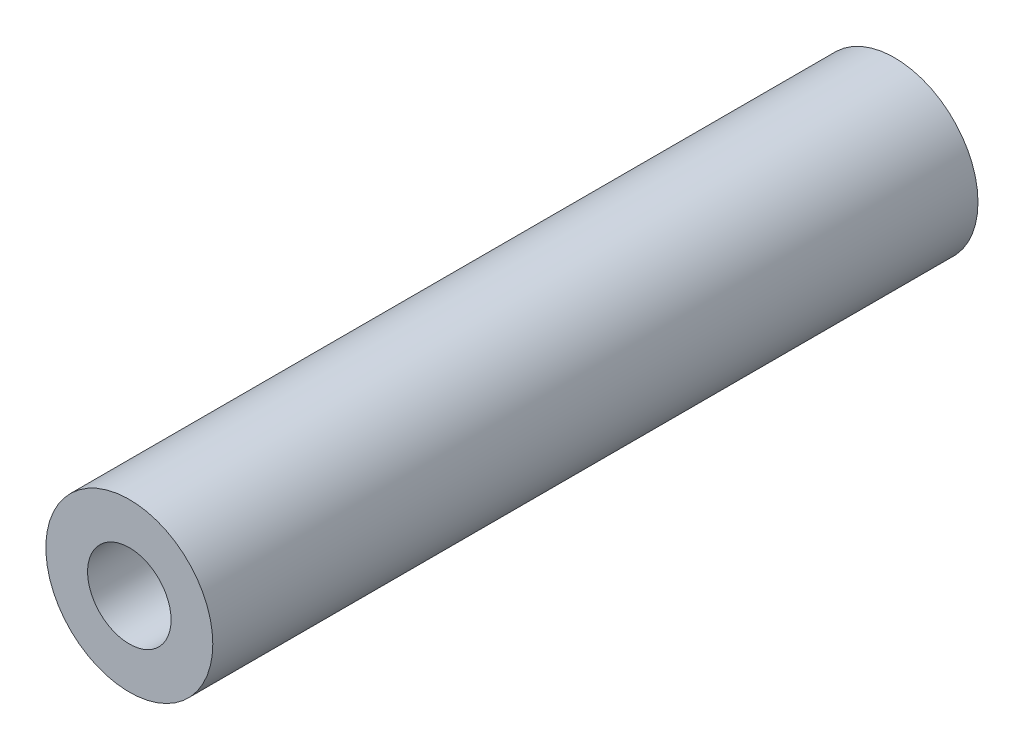
ISO-10303-21;
HEADER;
FILE_DESCRIPTION(('STEP AP214'),'2;1');
FILE_NAME('part.step','',(''),(''),'','','');
FILE_SCHEMA(('AUTOMOTIVE_DESIGN { 1 0 10303 214 1 1 1 1 }'));
ENDSEC;
DATA;
#1=APPLICATION_CONTEXT('core data for automotive mechanical design processes');
#2=APPLICATION_PROTOCOL_DEFINITION('international standard','automotive_design',2000,#1);
#3=PRODUCT_CONTEXT('',#1,'mechanical');
#4=PRODUCT('Part','Part','',(#3));
#5=PRODUCT_RELATED_PRODUCT_CATEGORY('part','',(#4));
#6=PRODUCT_DEFINITION_FORMATION('','',#4);
#7=PRODUCT_DEFINITION_CONTEXT('part definition',#1,'design');
#8=PRODUCT_DEFINITION('design','',#6,#7);
#9=PRODUCT_DEFINITION_SHAPE('','',#8);
#10=(LENGTH_UNIT() NAMED_UNIT(*) SI_UNIT(.MILLI.,.METRE.));
#11=(NAMED_UNIT(*) PLANE_ANGLE_UNIT() SI_UNIT($,.RADIAN.));
#12=(NAMED_UNIT(*) SI_UNIT($,.STERADIAN.) SOLID_ANGLE_UNIT());
#13=UNCERTAINTY_MEASURE_WITH_UNIT(LENGTH_MEASURE(1.E-05),#10,'distance_accuracy_value','');
#14=(GEOMETRIC_REPRESENTATION_CONTEXT(3) GLOBAL_UNCERTAINTY_ASSIGNED_CONTEXT((#13)) GLOBAL_UNIT_ASSIGNED_CONTEXT((#10,
#11,#12)) REPRESENTATION_CONTEXT('',''));
#15=CARTESIAN_POINT('',(0.,0.,0.));
#16=DIRECTION('',(0.,0.,1.));
#17=DIRECTION('',(1.,0.,0.));
#18=AXIS2_PLACEMENT_3D('',#15,#16,#17);
#19=CARTESIAN_POINT('',(0.,0.,55.));
#20=DIRECTION('',(0.,0.,-1.));
#21=DIRECTION('',(-1.,0.,0.));
#22=AXIS2_PLACEMENT_3D('',#19,#20,#21);
#23=CYLINDRICAL_SURFACE('',#22,6.);
#24=CARTESIAN_POINT('',(0.,0.,55.));
#25=DIRECTION('',(0.,0.,1.));
#26=DIRECTION('',(1.,0.,0.));
#27=AXIS2_PLACEMENT_3D('',#24,#25,#26);
#28=CIRCLE('',#27,6.);
#29=CARTESIAN_POINT('',(6.,0.,55.));
#30=VERTEX_POINT('',#29);
#31=EDGE_CURVE('E10',#30,#30,#28,.T.);
#32=ORIENTED_EDGE('',*,*,#31,.F.);
#33=EDGE_LOOP('',(#32));
#34=FACE_BOUND('',#33,.T.);
#35=CARTESIAN_POINT('',(0.,0.,0.));
#36=DIRECTION('',(0.,0.,1.));
#37=DIRECTION('',(1.,0.,0.));
#38=AXIS2_PLACEMENT_3D('',#35,#36,#37);
#39=CIRCLE('',#38,6.);
#40=CARTESIAN_POINT('',(6.,0.,0.));
#41=VERTEX_POINT('',#40);
#42=EDGE_CURVE('E33',#41,#41,#39,.T.);
#43=ORIENTED_EDGE('',*,*,#42,.T.);
#44=EDGE_LOOP('',(#43));
#45=FACE_BOUND('',#44,.T.);
#46=ADVANCED_FACE('F30',(#34,#45),#23,.T.);
#47=CARTESIAN_POINT('',(0.,0.,55.));
#48=DIRECTION('',(0.,0.,1.));
#49=DIRECTION('',(1.,0.,0.));
#50=AXIS2_PLACEMENT_3D('',#47,#48,#49);
#51=PLANE('',#50);
#52=CARTESIAN_POINT('',(0.,0.,55.));
#53=DIRECTION('',(0.,0.,1.));
#54=DIRECTION('',(1.,0.,0.));
#55=AXIS2_PLACEMENT_3D('',#52,#53,#54);
#56=CIRCLE('',#55,3.);
#57=CARTESIAN_POINT('',(3.,0.,55.));
#58=VERTEX_POINT('',#57);
#59=EDGE_CURVE('E42',#58,#58,#56,.T.);
#60=ORIENTED_EDGE('',*,*,#59,.F.);
#61=EDGE_LOOP('',(#60));
#62=FACE_BOUND('',#61,.T.);
#63=ORIENTED_EDGE('',*,*,#31,.T.);
#64=EDGE_LOOP('',(#63));
#65=FACE_BOUND('',#64,.T.);
#66=ADVANCED_FACE('F67',(#62,#65),#51,.T.);
#67=CARTESIAN_POINT('',(0.,0.,0.));
#68=DIRECTION('',(0.,0.,1.));
#69=DIRECTION('',(1.,0.,0.));
#70=AXIS2_PLACEMENT_3D('',#67,#68,#69);
#71=PLANE('',#70);
#72=CARTESIAN_POINT('',(0.,0.,0.));
#73=DIRECTION('',(0.,0.,-1.));
#74=DIRECTION('',(-1.,0.,0.));
#75=AXIS2_PLACEMENT_3D('',#72,#73,#74);
#76=CIRCLE('',#75,3.5);
#77=CARTESIAN_POINT('',(-3.5,0.,0.));
#78=VERTEX_POINT('',#77);
#79=EDGE_CURVE('E48',#78,#78,#76,.T.);
#80=ORIENTED_EDGE('',*,*,#79,.F.);
#81=EDGE_LOOP('',(#80));
#82=FACE_BOUND('',#81,.T.);
#83=ORIENTED_EDGE('',*,*,#42,.F.);
#84=EDGE_LOOP('',(#83));
#85=FACE_BOUND('',#84,.T.);
#86=ADVANCED_FACE('F63',(#82,#85),#71,.F.);
#87=CARTESIAN_POINT('',(0.,0.,41.));
#88=DIRECTION('',(0.,0.,1.));
#89=DIRECTION('',(1.,0.,0.));
#90=AXIS2_PLACEMENT_3D('',#87,#88,#89);
#91=CYLINDRICAL_SURFACE('',#90,3.);
#92=CARTESIAN_POINT('',(0.,0.,41.));
#93=DIRECTION('',(0.,0.,1.));
#94=DIRECTION('',(1.,0.,0.));
#95=AXIS2_PLACEMENT_3D('',#92,#93,#94);
#96=CIRCLE('',#95,3.);
#97=CARTESIAN_POINT('',(3.,0.,41.));
#98=VERTEX_POINT('',#97);
#99=EDGE_CURVE('E40',#98,#98,#96,.T.);
#100=CARTESIAN_POINT('',(3.,0.,41.));
#101=CARTESIAN_POINT('',(3.,0.,41.1458333333333));
#102=CARTESIAN_POINT('',(3.,0.,41.2916666666667));
#103=CARTESIAN_POINT('',(3.,0.,41.5833333333333));
#104=CARTESIAN_POINT('',(3.,0.,41.7291666666667));
#105=CARTESIAN_POINT('',(3.,0.,42.0208333333333));
#106=CARTESIAN_POINT('',(3.,0.,42.1666666666667));
#107=CARTESIAN_POINT('',(3.,0.,42.4583333333333));
#108=CARTESIAN_POINT('',(3.,0.,42.6041666666667));
#109=CARTESIAN_POINT('',(3.,0.,42.8958333333333));
#110=CARTESIAN_POINT('',(3.,0.,43.0416666666667));
#111=CARTESIAN_POINT('',(3.,0.,43.3333333333333));
#112=CARTESIAN_POINT('',(3.,0.,43.4791666666667));
#113=CARTESIAN_POINT('',(3.,0.,43.7708333333333));
#114=CARTESIAN_POINT('',(3.,0.,43.9166666666667));
#115=CARTESIAN_POINT('',(3.,0.,44.2083333333333));
#116=CARTESIAN_POINT('',(3.,0.,44.3541666666667));
#117=CARTESIAN_POINT('',(3.,0.,44.6458333333333));
#118=CARTESIAN_POINT('',(3.,0.,44.7916666666667));
#119=CARTESIAN_POINT('',(3.,0.,45.0833333333333));
#120=CARTESIAN_POINT('',(3.,0.,45.2291666666667));
#121=CARTESIAN_POINT('',(3.,0.,45.5208333333333));
#122=CARTESIAN_POINT('',(3.,0.,45.6666666666667));
#123=CARTESIAN_POINT('',(3.,0.,45.9583333333333));
#124=CARTESIAN_POINT('',(3.,0.,46.1041666666667));
#125=CARTESIAN_POINT('',(3.,0.,46.3958333333333));
#126=CARTESIAN_POINT('',(3.,0.,46.5416666666667));
#127=CARTESIAN_POINT('',(3.,0.,46.8333333333333));
#128=CARTESIAN_POINT('',(3.,0.,46.9791666666667));
#129=CARTESIAN_POINT('',(3.,0.,47.2708333333333));
#130=CARTESIAN_POINT('',(3.,0.,47.4166666666667));
#131=CARTESIAN_POINT('',(3.,0.,47.7083333333333));
#132=CARTESIAN_POINT('',(3.,0.,47.8541666666667));
#133=CARTESIAN_POINT('',(3.,0.,48.1458333333333));
#134=CARTESIAN_POINT('',(3.,0.,48.2916666666667));
#135=CARTESIAN_POINT('',(3.,0.,48.5833333333333));
#136=CARTESIAN_POINT('',(3.,0.,48.7291666666667));
#137=CARTESIAN_POINT('',(3.,0.,49.0208333333333));
#138=CARTESIAN_POINT('',(3.,0.,49.1666666666667));
#139=CARTESIAN_POINT('',(3.,0.,49.4583333333333));
#140=CARTESIAN_POINT('',(3.,0.,49.6041666666667));
#141=CARTESIAN_POINT('',(3.,0.,49.8958333333333));
#142=CARTESIAN_POINT('',(3.,0.,50.0416666666667));
#143=CARTESIAN_POINT('',(3.,0.,50.3333333333333));
#144=CARTESIAN_POINT('',(3.,0.,50.4791666666667));
#145=CARTESIAN_POINT('',(3.,0.,50.7708333333333));
#146=CARTESIAN_POINT('',(3.,0.,50.9166666666667));
#147=CARTESIAN_POINT('',(3.,0.,51.2083333333333));
#148=CARTESIAN_POINT('',(3.,0.,51.3541666666667));
#149=CARTESIAN_POINT('',(3.,0.,51.6458333333333));
#150=CARTESIAN_POINT('',(3.,0.,51.7916666666667));
#151=CARTESIAN_POINT('',(3.,0.,52.0833333333333));
#152=CARTESIAN_POINT('',(3.,0.,52.2291666666667));
#153=CARTESIAN_POINT('',(3.,0.,52.5208333333333));
#154=CARTESIAN_POINT('',(3.,0.,52.6666666666667));
#155=CARTESIAN_POINT('',(3.,0.,52.9583333333333));
#156=CARTESIAN_POINT('',(3.,0.,53.1041666666667));
#157=CARTESIAN_POINT('',(3.,0.,53.3958333333333));
#158=CARTESIAN_POINT('',(3.,0.,53.5416666666667));
#159=CARTESIAN_POINT('',(3.,0.,53.8333333333333));
#160=CARTESIAN_POINT('',(3.,0.,53.9791666666667));
#161=CARTESIAN_POINT('',(3.,0.,54.2708333333333));
#162=CARTESIAN_POINT('',(3.,0.,54.4166666666667));
#163=CARTESIAN_POINT('',(3.,0.,54.7083333333333));
#164=CARTESIAN_POINT('',(3.,0.,54.8541666666667));
#165=CARTESIAN_POINT('',(3.,0.,55.));
#166=B_SPLINE_CURVE_WITH_KNOTS('',3,(#100,#101,#102,#103,#104,#105,#106,#107,#108,#109,#110,
#111,#112,#113,#114,#115,#116,#117,#118,#119,#120,#121,#122,#123,#124,#125,#126,#127,#128,#129,
#130,#131,#132,#133,#134,#135,#136,#137,#138,#139,#140,#141,#142,#143,#144,#145,#146,#147,#148,
#149,#150,#151,#152,#153,#154,#155,#156,#157,#158,#159,#160,#161,#162,#163,#164,#165),
.UNSPECIFIED.,.F.,.F.,(4,2,2,2,2,2,2,2,2,2,2,2,2,2,2,2,2,2,2,2,2,2,2,2,2,2,2,2,2,2,2,2,4),(0.,
0.4375,0.875000000000001,1.3125,1.75,2.1875,2.625,3.0625,3.5,3.9375,4.375,4.8125,5.25,
5.68750000000001,6.12500000000001,6.56250000000001,7.00000000000001,7.43750000000001,
7.87500000000001,8.3125,8.75,9.1875,9.625,10.0625,10.5,10.9375,11.375,11.8125,12.25,12.6875,
13.125,13.5625,14.),.UNSPECIFIED.);
#167=EDGE_CURVE('BSEAM66',#98,#58,#166,.T.);
#168=ORIENTED_EDGE('',*,*,#99,.F.);
#169=ORIENTED_EDGE('',*,*,#59,.T.);
#170=ORIENTED_EDGE('',*,*,#167,.T.);
#171=ORIENTED_EDGE('',*,*,#167,.F.);
#172=EDGE_LOOP('',(#168,#170,#169,#171));
#173=FACE_BOUND('',#172,.T.);
#174=ADVANCED_FACE('F66',(#173),#91,.F.);
#175=CARTESIAN_POINT('',(0.,0.,41.));
#176=DIRECTION('',(0.,0.,1.));
#177=DIRECTION('',(1.,0.,0.));
#178=AXIS2_PLACEMENT_3D('',#175,#176,#177);
#179=PLANE('',#178);
#180=ORIENTED_EDGE('',*,*,#99,.T.);
#181=EDGE_LOOP('',(#180));
#182=FACE_BOUND('',#181,.T.);
#183=ADVANCED_FACE('F59',(#182),#179,.T.);
#184=CARTESIAN_POINT('',(0.,0.,14.));
#185=DIRECTION('',(0.,0.,-1.));
#186=DIRECTION('',(-1.,0.,0.));
#187=AXIS2_PLACEMENT_3D('',#184,#185,#186);
#188=CYLINDRICAL_SURFACE('',#187,3.5);
#189=CARTESIAN_POINT('',(0.,0.,14.));
#190=DIRECTION('',(0.,0.,-1.));
#191=DIRECTION('',(-1.,0.,0.));
#192=AXIS2_PLACEMENT_3D('',#189,#190,#191);
#193=CIRCLE('',#192,3.5);
#194=CARTESIAN_POINT('',(-3.5,0.,14.));
#195=VERTEX_POINT('',#194);
#196=EDGE_CURVE('E45',#195,#195,#193,.T.);
#197=CARTESIAN_POINT('',(-3.5,0.,14.));
#198=CARTESIAN_POINT('',(-3.5,0.,13.8541666666667));
#199=CARTESIAN_POINT('',(-3.5,0.,13.7083333333333));
#200=CARTESIAN_POINT('',(-3.5,0.,13.4166666666667));
#201=CARTESIAN_POINT('',(-3.5,0.,13.2708333333333));
#202=CARTESIAN_POINT('',(-3.5,0.,12.9791666666667));
#203=CARTESIAN_POINT('',(-3.5,0.,12.8333333333333));
#204=CARTESIAN_POINT('',(-3.5,0.,12.5416666666667));
#205=CARTESIAN_POINT('',(-3.5,0.,12.3958333333333));
#206=CARTESIAN_POINT('',(-3.5,0.,12.1041666666667));
#207=CARTESIAN_POINT('',(-3.5,0.,11.9583333333333));
#208=CARTESIAN_POINT('',(-3.5,0.,11.6666666666667));
#209=CARTESIAN_POINT('',(-3.5,0.,11.5208333333333));
#210=CARTESIAN_POINT('',(-3.5,0.,11.2291666666667));
#211=CARTESIAN_POINT('',(-3.5,0.,11.0833333333333));
#212=CARTESIAN_POINT('',(-3.5,0.,10.7916666666667));
#213=CARTESIAN_POINT('',(-3.5,0.,10.6458333333333));
#214=CARTESIAN_POINT('',(-3.5,0.,10.3541666666667));
#215=CARTESIAN_POINT('',(-3.5,0.,10.2083333333333));
#216=CARTESIAN_POINT('',(-3.5,0.,9.91666666666667));
#217=CARTESIAN_POINT('',(-3.5,0.,9.77083333333333));
#218=CARTESIAN_POINT('',(-3.5,0.,9.47916666666667));
#219=CARTESIAN_POINT('',(-3.5,0.,9.33333333333333));
#220=CARTESIAN_POINT('',(-3.5,0.,9.04166666666667));
#221=CARTESIAN_POINT('',(-3.5,0.,8.89583333333333));
#222=CARTESIAN_POINT('',(-3.5,0.,8.60416666666667));
#223=CARTESIAN_POINT('',(-3.5,0.,8.45833333333333));
#224=CARTESIAN_POINT('',(-3.5,0.,8.16666666666667));
#225=CARTESIAN_POINT('',(-3.5,0.,8.02083333333333));
#226=CARTESIAN_POINT('',(-3.5,0.,7.72916666666667));
#227=CARTESIAN_POINT('',(-3.5,0.,7.58333333333333));
#228=CARTESIAN_POINT('',(-3.5,0.,7.29166666666667));
#229=CARTESIAN_POINT('',(-3.5,0.,7.14583333333333));
#230=CARTESIAN_POINT('',(-3.5,0.,6.85416666666667));
#231=CARTESIAN_POINT('',(-3.5,0.,6.70833333333333));
#232=CARTESIAN_POINT('',(-3.5,0.,6.41666666666667));
#233=CARTESIAN_POINT('',(-3.5,0.,6.27083333333333));
#234=CARTESIAN_POINT('',(-3.5,0.,5.97916666666667));
#235=CARTESIAN_POINT('',(-3.5,0.,5.83333333333333));
#236=CARTESIAN_POINT('',(-3.5,0.,5.54166666666667));
#237=CARTESIAN_POINT('',(-3.5,0.,5.39583333333333));
#238=CARTESIAN_POINT('',(-3.5,0.,5.10416666666667));
#239=CARTESIAN_POINT('',(-3.5,0.,4.95833333333333));
#240=CARTESIAN_POINT('',(-3.5,0.,4.66666666666667));
#241=CARTESIAN_POINT('',(-3.5,0.,4.52083333333333));
#242=CARTESIAN_POINT('',(-3.5,0.,4.22916666666667));
#243=CARTESIAN_POINT('',(-3.5,0.,4.08333333333334));
#244=CARTESIAN_POINT('',(-3.5,0.,3.79166666666667));
#245=CARTESIAN_POINT('',(-3.5,0.,3.64583333333333));
#246=CARTESIAN_POINT('',(-3.5,0.,3.35416666666667));
#247=CARTESIAN_POINT('',(-3.5,0.,3.20833333333333));
#248=CARTESIAN_POINT('',(-3.5,0.,2.91666666666667));
#249=CARTESIAN_POINT('',(-3.5,0.,2.77083333333333));
#250=CARTESIAN_POINT('',(-3.5,0.,2.47916666666667));
#251=CARTESIAN_POINT('',(-3.5,0.,2.33333333333333));
#252=CARTESIAN_POINT('',(-3.5,0.,2.04166666666667));
#253=CARTESIAN_POINT('',(-3.5,0.,1.89583333333334));
#254=CARTESIAN_POINT('',(-3.5,0.,1.60416666666667));
#255=CARTESIAN_POINT('',(-3.5,0.,1.45833333333333));
#256=CARTESIAN_POINT('',(-3.5,0.,1.16666666666667));
#257=CARTESIAN_POINT('',(-3.5,0.,1.02083333333334));
#258=CARTESIAN_POINT('',(-3.5,0.,0.729166666666669));
#259=CARTESIAN_POINT('',(-3.5,0.,0.583333333333336));
#260=CARTESIAN_POINT('',(-3.5,0.,0.291666666666669));
#261=CARTESIAN_POINT('',(-3.5,0.,0.145833333333335));
#262=CARTESIAN_POINT('',(-3.5,0.,0.));
#263=B_SPLINE_CURVE_WITH_KNOTS('',3,(#197,#198,#199,#200,#201,#202,#203,#204,#205,#206,#207,
#208,#209,#210,#211,#212,#213,#214,#215,#216,#217,#218,#219,#220,#221,#222,#223,#224,#225,#226,
#227,#228,#229,#230,#231,#232,#233,#234,#235,#236,#237,#238,#239,#240,#241,#242,#243,#244,#245,
#246,#247,#248,#249,#250,#251,#252,#253,#254,#255,#256,#257,#258,#259,#260,#261,#262),
.UNSPECIFIED.,.F.,.F.,(4,2,2,2,2,2,2,2,2,2,2,2,2,2,2,2,2,2,2,2,2,2,2,2,2,2,2,2,2,2,2,2,4),(0.,
0.437499999999999,0.874999999999999,1.3125,1.75,2.1875,2.625,3.0625,3.5,3.9375,4.375,4.8125,
5.25,5.6875,6.125,6.5625,7.,7.4375,7.875,8.3125,8.75,9.1875,9.625,10.0625,10.5,10.9375,11.375,
11.8125,12.25,12.6875,13.125,13.5625,14.),.UNSPECIFIED.);
#264=EDGE_CURVE('BSEAM56',#195,#78,#263,.T.);
#265=ORIENTED_EDGE('',*,*,#196,.F.);
#266=ORIENTED_EDGE('',*,*,#79,.T.);
#267=ORIENTED_EDGE('',*,*,#264,.T.);
#268=ORIENTED_EDGE('',*,*,#264,.F.);
#269=EDGE_LOOP('',(#265,#267,#266,#268));
#270=FACE_BOUND('',#269,.T.);
#271=ADVANCED_FACE('F56',(#270),#188,.F.);
#272=CARTESIAN_POINT('',(0.,0.,14.));
#273=DIRECTION('',(0.,0.,-1.));
#274=DIRECTION('',(-1.,0.,0.));
#275=AXIS2_PLACEMENT_3D('',#272,#273,#274);
#276=PLANE('',#275);
#277=ORIENTED_EDGE('',*,*,#196,.T.);
#278=EDGE_LOOP('',(#277));
#279=FACE_BOUND('',#278,.T.);
#280=ADVANCED_FACE('F54',(#279),#276,.T.);
#281=CLOSED_SHELL('',(#46,#66,#86,#174,#183,#271,#280));
#282=MANIFOLD_SOLID_BREP('B2',#281);
#283=ADVANCED_BREP_SHAPE_REPRESENTATION('',(#18,#282),#14);
#284=SHAPE_DEFINITION_REPRESENTATION(#9,#283);
ENDSEC;
END-ISO-10303-21;
